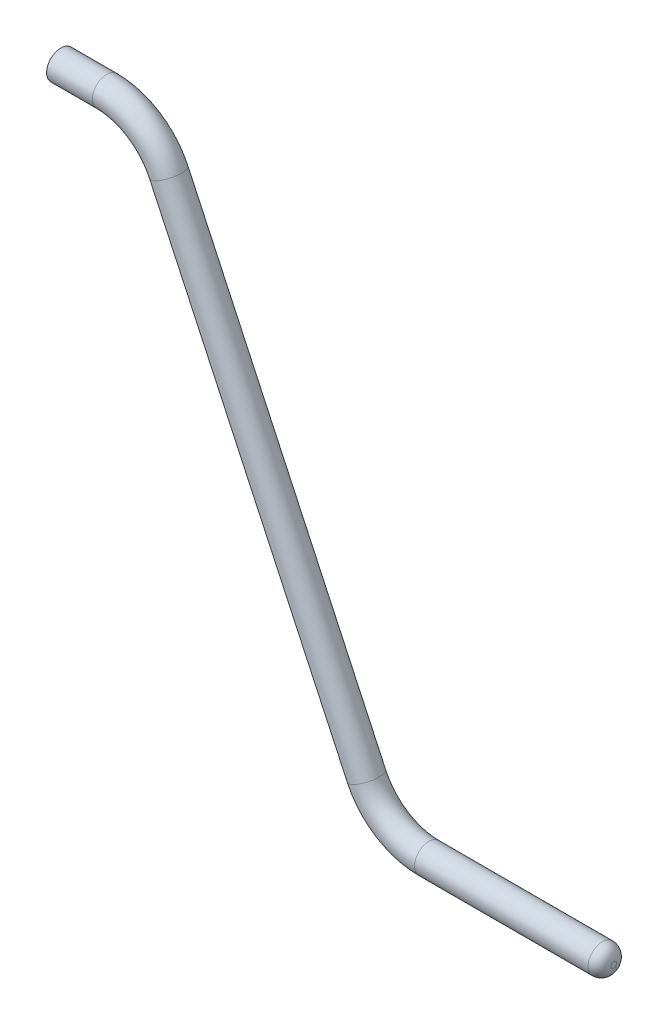
ISO-10303-21;
HEADER;
FILE_DESCRIPTION(('STEP AP214'),'2;1');
FILE_NAME('part.step','',(''),(''),'','','');
FILE_SCHEMA(('AUTOMOTIVE_DESIGN { 1 0 10303 214 1 1 1 1 }'));
ENDSEC;
DATA;
#1=APPLICATION_CONTEXT('core data for automotive mechanical design processes');
#2=APPLICATION_PROTOCOL_DEFINITION('international standard','automotive_design',2000,#1);
#3=PRODUCT_CONTEXT('',#1,'mechanical');
#4=PRODUCT('Part','Part','',(#3));
#5=PRODUCT_RELATED_PRODUCT_CATEGORY('part','',(#4));
#6=PRODUCT_DEFINITION_FORMATION('','',#4);
#7=PRODUCT_DEFINITION_CONTEXT('part definition',#1,'design');
#8=PRODUCT_DEFINITION('design','',#6,#7);
#9=PRODUCT_DEFINITION_SHAPE('','',#8);
#10=(LENGTH_UNIT() NAMED_UNIT(*) SI_UNIT(.MILLI.,.METRE.));
#11=(NAMED_UNIT(*) PLANE_ANGLE_UNIT() SI_UNIT($,.RADIAN.));
#12=(NAMED_UNIT(*) SI_UNIT($,.STERADIAN.) SOLID_ANGLE_UNIT());
#13=UNCERTAINTY_MEASURE_WITH_UNIT(LENGTH_MEASURE(1.E-05),#10,'distance_accuracy_value','');
#14=(GEOMETRIC_REPRESENTATION_CONTEXT(3) GLOBAL_UNCERTAINTY_ASSIGNED_CONTEXT((#13)) GLOBAL_UNIT_ASSIGNED_CONTEXT((#10,
#11,#12)) REPRESENTATION_CONTEXT('',''));
#15=CARTESIAN_POINT('',(0.,0.,0.));
#16=DIRECTION('',(0.,0.,1.));
#17=DIRECTION('',(1.,0.,0.));
#18=AXIS2_PLACEMENT_3D('',#15,#16,#17);
#19=CARTESIAN_POINT('',(-22.1699792618325,22.,0.));
#20=DIRECTION('',(-1.,0.,0.));
#21=DIRECTION('',(0.,-1.,0.));
#22=AXIS2_PLACEMENT_3D('',#19,#20,#21);
#23=CYLINDRICAL_SURFACE('',#22,0.625000000000001);
#24=CARTESIAN_POINT('',(-22.1699792618325,22.,0.));
#25=DIRECTION('',(1.,0.,0.));
#26=DIRECTION('',(0.,0.,-1.));
#27=AXIS2_PLACEMENT_3D('',#24,#25,#26);
#28=CIRCLE('',#27,0.625000000000001);
#29=CARTESIAN_POINT('',(-22.1699792618325,22.625,0.));
#30=VERTEX_POINT('',#29);
#31=EDGE_CURVE('E50',#30,#30,#28,.T.);
#32=ORIENTED_EDGE('',*,*,#31,.F.);
#33=EDGE_LOOP('',(#32));
#34=FACE_BOUND('',#33,.T.);
#35=CARTESIAN_POINT('',(-24.1699792618325,22.,0.));
#36=DIRECTION('',(1.,0.,0.));
#37=DIRECTION('',(0.,0.,-1.));
#38=AXIS2_PLACEMENT_3D('',#35,#36,#37);
#39=CIRCLE('',#38,0.625000000000001);
#40=CARTESIAN_POINT('',(-24.1699792618325,22.,-0.625000000000001));
#41=VERTEX_POINT('',#40);
#42=EDGE_CURVE('E46',#41,#41,#39,.T.);
#43=ORIENTED_EDGE('',*,*,#42,.T.);
#44=EDGE_LOOP('',(#43));
#45=FACE_BOUND('',#44,.T.);
#46=ADVANCED_FACE('F35',(#34,#45),#23,.T.);
#47=CARTESIAN_POINT('',(-22.1699792618325,19.,0.));
#48=DIRECTION('',(0.,0.,1.));
#49=DIRECTION('',(1.,0.,0.));
#50=AXIS2_PLACEMENT_3D('',#47,#48,#49);
#51=TOROIDAL_SURFACE('',#50,3.,0.625000000000001);
#52=CARTESIAN_POINT('',(-19.4510559007225,20.2678547852221,0.));
#53=DIRECTION('',(0.422618261740701,-0.906307787036649,0.));
#54=DIRECTION('',(0.,0.,-1.));
#55=AXIS2_PLACEMENT_3D('',#52,#53,#54);
#56=CIRCLE('',#55,0.625000000000001);
#57=CARTESIAN_POINT('',(-18.8846135338246,20.53199119881,0.));
#58=VERTEX_POINT('',#57);
#59=EDGE_CURVE('E55',#58,#58,#56,.T.);
#60=CARTESIAN_POINT('',(-22.1699792618325,19.,0.));
#61=DIRECTION('',(0.,0.,1.));
#62=DIRECTION('',(1.,0.,0.));
#63=AXIS2_PLACEMENT_3D('',#60,#61,#62);
#64=CIRCLE('',#63,3.625);
#65=EDGE_CURVE('',#58,#30,#64,.T.);
#66=ORIENTED_EDGE('',*,*,#59,.F.);
#67=ORIENTED_EDGE('',*,*,#31,.T.);
#68=ORIENTED_EDGE('',*,*,#65,.T.);
#69=ORIENTED_EDGE('',*,*,#65,.F.);
#70=EDGE_LOOP('',(#66,#68,#67,#69));
#71=FACE_BOUND('',#70,.T.);
#72=ADVANCED_FACE('F76',(#71),#51,.T.);
#73=CARTESIAN_POINT('',(-10.8077125786875,1.7321452147779,0.));
#74=DIRECTION('',(-0.422618261740701,0.906307787036649,0.));
#75=DIRECTION('',(-0.906307787036649,-0.422618261740701,0.));
#76=AXIS2_PLACEMENT_3D('',#73,#74,#75);
#77=CYLINDRICAL_SURFACE('',#76,0.625000000000001);
#78=CARTESIAN_POINT('',(-10.8077125786875,1.7321452147779,0.));
#79=DIRECTION('',(0.422618261740701,-0.906307787036649,0.));
#80=DIRECTION('',(0.,0.,-1.));
#81=AXIS2_PLACEMENT_3D('',#78,#79,#80);
#82=CIRCLE('',#81,0.625000000000001);
#83=CARTESIAN_POINT('',(-11.3741549455854,1.46800880118996,0.));
#84=VERTEX_POINT('',#83);
#85=EDGE_CURVE('E58',#84,#84,#82,.T.);
#86=ORIENTED_EDGE('',*,*,#85,.F.);
#87=EDGE_LOOP('',(#86));
#88=FACE_BOUND('',#87,.T.);
#89=ORIENTED_EDGE('',*,*,#59,.T.);
#90=EDGE_LOOP('',(#89));
#91=FACE_BOUND('',#90,.T.);
#92=ADVANCED_FACE('F70',(#88,#91),#77,.T.);
#93=CARTESIAN_POINT('',(-8.08878921757753,3.,0.));
#94=DIRECTION('',(0.,0.,-1.));
#95=DIRECTION('',(-1.,0.,0.));
#96=AXIS2_PLACEMENT_3D('',#93,#94,#95);
#97=TOROIDAL_SURFACE('',#96,3.,0.625000000000001);
#98=CARTESIAN_POINT('',(-8.08878921757753,0.,0.));
#99=DIRECTION('',(1.,0.,0.));
#100=DIRECTION('',(0.,0.,-1.));
#101=AXIS2_PLACEMENT_3D('',#98,#99,#100);
#102=CIRCLE('',#101,0.625000000000001);
#103=CARTESIAN_POINT('',(-8.08878921757753,-0.625000000000001,0.));
#104=VERTEX_POINT('',#103);
#105=EDGE_CURVE('E61',#104,#104,#102,.T.);
#106=CARTESIAN_POINT('',(-8.08878921757753,3.,0.));
#107=DIRECTION('',(0.,0.,-1.));
#108=DIRECTION('',(-1.,0.,0.));
#109=AXIS2_PLACEMENT_3D('',#106,#107,#108);
#110=CIRCLE('',#109,3.625);
#111=EDGE_CURVE('',#104,#84,#110,.T.);
#112=ORIENTED_EDGE('',*,*,#105,.F.);
#113=ORIENTED_EDGE('',*,*,#85,.T.);
#114=ORIENTED_EDGE('',*,*,#111,.T.);
#115=ORIENTED_EDGE('',*,*,#111,.F.);
#116=EDGE_LOOP('',(#112,#114,#113,#115));
#117=FACE_BOUND('',#116,.T.);
#118=ADVANCED_FACE('F67',(#117),#97,.T.);
#119=CARTESIAN_POINT('',(-8.08878921757753,0.,0.));
#120=DIRECTION('',(1.,0.,0.));
#121=DIRECTION('',(0.,1.,0.));
#122=AXIS2_PLACEMENT_3D('',#119,#120,#121);
#123=CYLINDRICAL_SURFACE('',#122,0.625000000000001);
#124=CARTESIAN_POINT('',(-0.5,0.,0.));
#125=DIRECTION('',(1.,0.,0.));
#126=DIRECTION('',(0.,0.,-1.));
#127=AXIS2_PLACEMENT_3D('',#124,#125,#126);
#128=CIRCLE('',#127,0.625000000000001);
#129=CARTESIAN_POINT('',(-0.5,0.,-0.625000000000001));
#130=VERTEX_POINT('',#129);
#131=EDGE_CURVE('E10',#130,#130,#128,.F.);
#132=ORIENTED_EDGE('',*,*,#131,.T.);
#133=EDGE_LOOP('',(#132));
#134=FACE_BOUND('',#133,.T.);
#135=ORIENTED_EDGE('',*,*,#105,.T.);
#136=EDGE_LOOP('',(#135));
#137=FACE_BOUND('',#136,.T.);
#138=ADVANCED_FACE('F65',(#134,#137),#123,.T.);
#139=CARTESIAN_POINT('',(-24.1699792618325,22.,0.));
#140=DIRECTION('',(1.,0.,0.));
#141=DIRECTION('',(0.,0.,-1.));
#142=AXIS2_PLACEMENT_3D('',#139,#140,#141);
#143=PLANE('',#142);
#144=ORIENTED_EDGE('',*,*,#42,.F.);
#145=EDGE_LOOP('',(#144));
#146=FACE_BOUND('',#145,.T.);
#147=ADVANCED_FACE('F89',(#146),#143,.F.);
#148=CARTESIAN_POINT('',(0.,0.,0.));
#149=DIRECTION('',(1.,0.,0.));
#150=DIRECTION('',(0.,0.,-1.));
#151=AXIS2_PLACEMENT_3D('',#148,#149,#150);
#152=PLANE('',#151);
#153=CARTESIAN_POINT('',(0.,0.,0.));
#154=DIRECTION('',(1.,0.,0.));
#155=DIRECTION('',(0.,0.,-1.));
#156=AXIS2_PLACEMENT_3D('',#153,#154,#155);
#157=CIRCLE('',#156,0.125000000000001);
#158=CARTESIAN_POINT('',(0.,0.,-0.125000000000001));
#159=VERTEX_POINT('',#158);
#160=EDGE_CURVE('E42',#159,#159,#157,.T.);
#161=ORIENTED_EDGE('',*,*,#160,.T.);
#162=EDGE_LOOP('',(#161));
#163=FACE_BOUND('',#162,.T.);
#164=ADVANCED_FACE('F91',(#163),#152,.T.);
#165=CARTESIAN_POINT('',(-0.5,0.,0.));
#166=DIRECTION('',(1.,0.,0.));
#167=DIRECTION('',(0.,0.,-1.));
#168=AXIS2_PLACEMENT_3D('',#165,#166,#167);
#169=DEGENERATE_TOROIDAL_SURFACE('',#168,0.125000000000001,0.5,.T.);
#170=ORIENTED_EDGE('',*,*,#131,.F.);
#171=EDGE_LOOP('',(#170));
#172=FACE_BOUND('',#171,.T.);
#173=ORIENTED_EDGE('',*,*,#160,.F.);
#174=EDGE_LOOP('',(#173));
#175=FACE_BOUND('',#174,.T.);
#176=ADVANCED_FACE('F37',(#172,#175),#169,.T.);
#177=CLOSED_SHELL('',(#46,#72,#92,#118,#138,#147,#164,#176));
#178=MANIFOLD_SOLID_BREP('B2',#177);
#179=ADVANCED_BREP_SHAPE_REPRESENTATION('',(#18,#178),#14);
#180=SHAPE_DEFINITION_REPRESENTATION(#9,#179);
ENDSEC;
END-ISO-10303-21;
